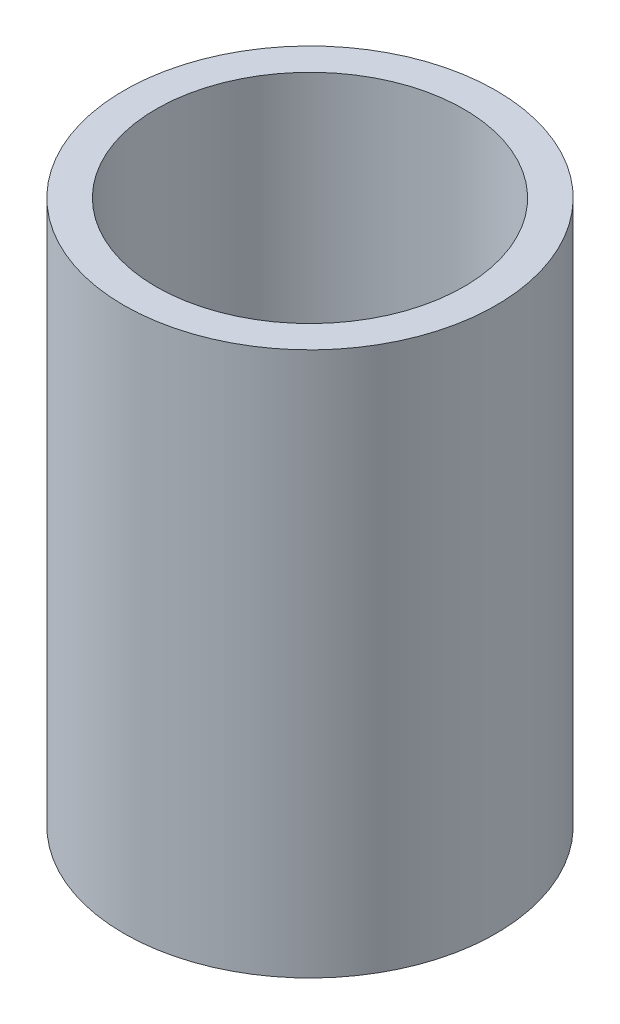
ISO-10303-21;
HEADER;
FILE_DESCRIPTION(('STEP AP214'),'2;1');
FILE_NAME('part.step','',(''),(''),'','','');
FILE_SCHEMA(('AUTOMOTIVE_DESIGN { 1 0 10303 214 1 1 1 1 }'));
ENDSEC;
DATA;
#1=APPLICATION_CONTEXT('core data for automotive mechanical design processes');
#2=APPLICATION_PROTOCOL_DEFINITION('international standard','automotive_design',2000,#1);
#3=PRODUCT_CONTEXT('',#1,'mechanical');
#4=PRODUCT('Part','Part','',(#3));
#5=PRODUCT_RELATED_PRODUCT_CATEGORY('part','',(#4));
#6=PRODUCT_DEFINITION_FORMATION('','',#4);
#7=PRODUCT_DEFINITION_CONTEXT('part definition',#1,'design');
#8=PRODUCT_DEFINITION('design','',#6,#7);
#9=PRODUCT_DEFINITION_SHAPE('','',#8);
#10=(LENGTH_UNIT() NAMED_UNIT(*) SI_UNIT(.MILLI.,.METRE.));
#11=(NAMED_UNIT(*) PLANE_ANGLE_UNIT() SI_UNIT($,.RADIAN.));
#12=(NAMED_UNIT(*) SI_UNIT($,.STERADIAN.) SOLID_ANGLE_UNIT());
#13=UNCERTAINTY_MEASURE_WITH_UNIT(LENGTH_MEASURE(1.E-05),#10,'distance_accuracy_value','');
#14=(GEOMETRIC_REPRESENTATION_CONTEXT(3) GLOBAL_UNCERTAINTY_ASSIGNED_CONTEXT((#13)) GLOBAL_UNIT_ASSIGNED_CONTEXT((#10,
#11,#12)) REPRESENTATION_CONTEXT('',''));
#15=CARTESIAN_POINT('',(0.,0.,0.));
#16=DIRECTION('',(0.,0.,1.));
#17=DIRECTION('',(1.,0.,0.));
#18=AXIS2_PLACEMENT_3D('',#15,#16,#17);
#19=CARTESIAN_POINT('',(0.,-9.86256775948207,0.));
#20=DIRECTION('',(0.,1.,0.));
#21=DIRECTION('',(0.,0.,1.));
#22=AXIS2_PLACEMENT_3D('',#19,#20,#21);
#23=PLANE('',#22);
#24=CARTESIAN_POINT('',(0.,-9.86256775948207,0.));
#25=DIRECTION('',(0.,1.,0.));
#26=DIRECTION('',(0.,0.,1.));
#27=AXIS2_PLACEMENT_3D('',#24,#25,#26);
#28=CIRCLE('',#27,6.5);
#29=CARTESIAN_POINT('',(0.,-9.86256775948207,6.5));
#30=VERTEX_POINT('',#29);
#31=EDGE_CURVE('E10',#30,#30,#28,.T.);
#32=ORIENTED_EDGE('',*,*,#31,.T.);
#33=EDGE_LOOP('',(#32));
#34=FACE_BOUND('',#33,.T.);
#35=CARTESIAN_POINT('',(0.,-9.86256775948207,0.));
#36=DIRECTION('',(0.,1.,0.));
#37=DIRECTION('',(0.,0.,1.));
#38=AXIS2_PLACEMENT_3D('',#35,#36,#37);
#39=CIRCLE('',#38,5.375);
#40=CARTESIAN_POINT('',(0.,-9.86256775948207,5.375));
#41=VERTEX_POINT('',#40);
#42=EDGE_CURVE('E55',#41,#41,#39,.T.);
#43=ORIENTED_EDGE('',*,*,#42,.F.);
#44=EDGE_LOOP('',(#43));
#45=FACE_BOUND('',#44,.T.);
#46=ADVANCED_FACE('F41',(#34,#45),#23,.T.);
#47=CARTESIAN_POINT('',(0.,-28.8625677594821,0.));
#48=DIRECTION('',(0.,1.,0.));
#49=DIRECTION('',(0.,0.,1.));
#50=AXIS2_PLACEMENT_3D('',#47,#48,#49);
#51=PLANE('',#50);
#52=CARTESIAN_POINT('',(0.,-28.8625677594821,0.));
#53=DIRECTION('',(0.,1.,0.));
#54=DIRECTION('',(0.,0.,1.));
#55=AXIS2_PLACEMENT_3D('',#52,#53,#54);
#56=CIRCLE('',#55,6.5);
#57=CARTESIAN_POINT('',(0.,-28.8625677594821,6.5));
#58=VERTEX_POINT('',#57);
#59=EDGE_CURVE('E45',#58,#58,#56,.T.);
#60=ORIENTED_EDGE('',*,*,#59,.F.);
#61=EDGE_LOOP('',(#60));
#62=FACE_BOUND('',#61,.T.);
#63=CARTESIAN_POINT('',(0.,-28.8625677594821,0.));
#64=DIRECTION('',(0.,1.,0.));
#65=DIRECTION('',(0.,0.,1.));
#66=AXIS2_PLACEMENT_3D('',#63,#64,#65);
#67=CIRCLE('',#66,5.375);
#68=CARTESIAN_POINT('',(0.,-28.8625677594821,5.375));
#69=VERTEX_POINT('',#68);
#70=EDGE_CURVE('E57',#69,#69,#67,.T.);
#71=ORIENTED_EDGE('',*,*,#70,.T.);
#72=EDGE_LOOP('',(#71));
#73=FACE_BOUND('',#72,.T.);
#74=ADVANCED_FACE('F70',(#62,#73),#51,.F.);
#75=CARTESIAN_POINT('',(0.,-9.86256775948207,0.));
#76=DIRECTION('',(0.,-1.,0.));
#77=DIRECTION('',(0.,0.,-1.));
#78=AXIS2_PLACEMENT_3D('',#75,#76,#77);
#79=CYLINDRICAL_SURFACE('',#78,6.5);
#80=ORIENTED_EDGE('',*,*,#31,.F.);
#81=EDGE_LOOP('',(#80));
#82=FACE_BOUND('',#81,.T.);
#83=ORIENTED_EDGE('',*,*,#59,.T.);
#84=EDGE_LOOP('',(#83));
#85=FACE_BOUND('',#84,.T.);
#86=ADVANCED_FACE('F43',(#82,#85),#79,.T.);
#87=CARTESIAN_POINT('',(0.,-9.86256775948207,0.));
#88=DIRECTION('',(0.,-1.,0.));
#89=DIRECTION('',(0.,0.,-1.));
#90=AXIS2_PLACEMENT_3D('',#87,#88,#89);
#91=CYLINDRICAL_SURFACE('',#90,5.375);
#92=ORIENTED_EDGE('',*,*,#42,.T.);
#93=EDGE_LOOP('',(#92));
#94=FACE_BOUND('',#93,.T.);
#95=ORIENTED_EDGE('',*,*,#70,.F.);
#96=EDGE_LOOP('',(#95));
#97=FACE_BOUND('',#96,.T.);
#98=ADVANCED_FACE('F66',(#94,#97),#91,.F.);
#99=CLOSED_SHELL('',(#46,#74,#86,#98));
#100=MANIFOLD_SOLID_BREP('B2',#99);
#101=ADVANCED_BREP_SHAPE_REPRESENTATION('',(#18,#100),#14);
#102=SHAPE_DEFINITION_REPRESENTATION(#9,#101);
ENDSEC;
END-ISO-10303-21;
